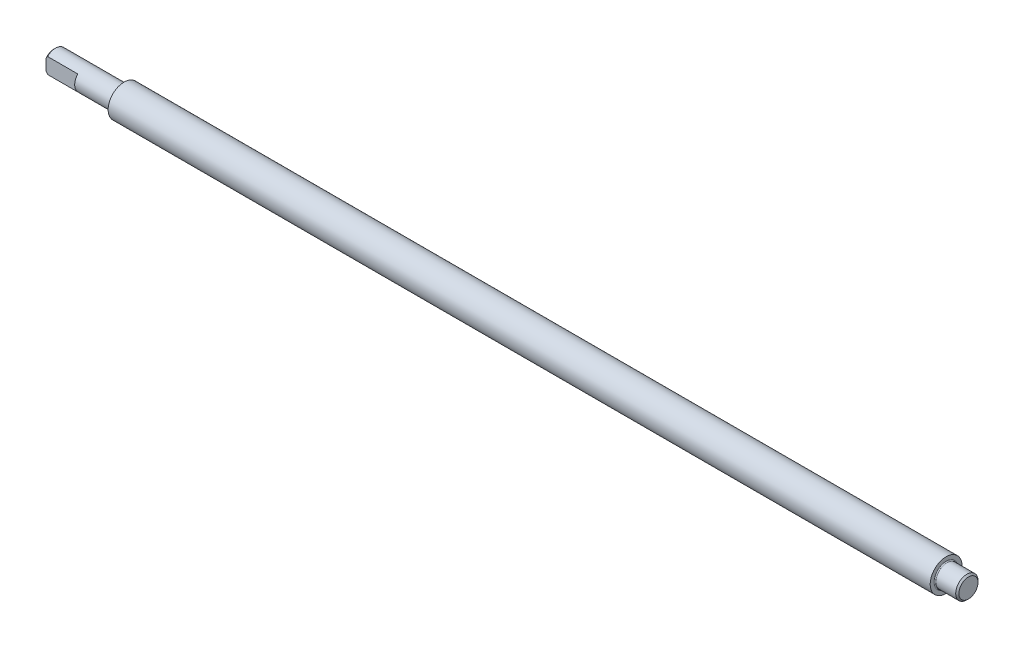
ISO-10303-21;
HEADER;
FILE_DESCRIPTION(('STEP AP214'),'2;1');
FILE_NAME('part.step','',(''),(''),'','','');
FILE_SCHEMA(('AUTOMOTIVE_DESIGN { 1 0 10303 214 1 1 1 1 }'));
ENDSEC;
DATA;
#1=APPLICATION_CONTEXT('core data for automotive mechanical design processes');
#2=APPLICATION_PROTOCOL_DEFINITION('international standard','automotive_design',2000,#1);
#3=PRODUCT_CONTEXT('',#1,'mechanical');
#4=PRODUCT('Part','Part','',(#3));
#5=PRODUCT_RELATED_PRODUCT_CATEGORY('part','',(#4));
#6=PRODUCT_DEFINITION_FORMATION('','',#4);
#7=PRODUCT_DEFINITION_CONTEXT('part definition',#1,'design');
#8=PRODUCT_DEFINITION('design','',#6,#7);
#9=PRODUCT_DEFINITION_SHAPE('','',#8);
#10=(LENGTH_UNIT() NAMED_UNIT(*) SI_UNIT(.MILLI.,.METRE.));
#11=(NAMED_UNIT(*) PLANE_ANGLE_UNIT() SI_UNIT($,.RADIAN.));
#12=(NAMED_UNIT(*) SI_UNIT($,.STERADIAN.) SOLID_ANGLE_UNIT());
#13=UNCERTAINTY_MEASURE_WITH_UNIT(LENGTH_MEASURE(1.E-05),#10,'distance_accuracy_value','');
#14=(GEOMETRIC_REPRESENTATION_CONTEXT(3) GLOBAL_UNCERTAINTY_ASSIGNED_CONTEXT((#13)) GLOBAL_UNIT_ASSIGNED_CONTEXT((#10,
#11,#12)) REPRESENTATION_CONTEXT('',''));
#15=CARTESIAN_POINT('',(0.,0.,0.));
#16=DIRECTION('',(0.,0.,1.));
#17=DIRECTION('',(1.,0.,0.));
#18=AXIS2_PLACEMENT_3D('',#15,#16,#17);
#19=CARTESIAN_POINT('',(280.,0.,0.));
#20=DIRECTION('',(1.,0.,0.));
#21=DIRECTION('',(0.,0.,-1.));
#22=AXIS2_PLACEMENT_3D('',#19,#20,#21);
#23=PLANE('',#22);
#24=CARTESIAN_POINT('',(280.,0.,0.));
#25=DIRECTION('',(1.,0.,0.));
#26=DIRECTION('',(0.,0.,-1.));
#27=AXIS2_PLACEMENT_3D('',#24,#25,#26);
#28=CIRCLE('',#27,3.79999999999988);
#29=CARTESIAN_POINT('',(280.,0.,-3.79999999999988));
#30=VERTEX_POINT('',#29);
#31=EDGE_CURVE('E11',#30,#30,#28,.F.);
#32=ORIENTED_EDGE('',*,*,#31,.T.);
#33=EDGE_LOOP('',(#32));
#34=FACE_BOUND('',#33,.T.);
#35=CARTESIAN_POINT('',(280.,0.,0.));
#36=DIRECTION('',(1.,0.,0.));
#37=DIRECTION('',(0.,0.,-1.));
#38=AXIS2_PLACEMENT_3D('',#35,#36,#37);
#39=CIRCLE('',#38,5.);
#40=CARTESIAN_POINT('',(280.,0.,-5.));
#41=VERTEX_POINT('',#40);
#42=EDGE_CURVE('E82',#41,#41,#39,.T.);
#43=ORIENTED_EDGE('',*,*,#42,.T.);
#44=EDGE_LOOP('',(#43));
#45=FACE_BOUND('',#44,.T.);
#46=ADVANCED_FACE('F33',(#34,#45),#23,.T.);
#47=CARTESIAN_POINT('',(22.,5.,0.));
#48=DIRECTION('',(-1.,0.,0.));
#49=DIRECTION('',(0.,0.,1.));
#50=AXIS2_PLACEMENT_3D('',#47,#48,#49);
#51=PLANE('',#50);
#52=CARTESIAN_POINT('',(22.,0.,0.));
#53=DIRECTION('',(-1.,0.,0.));
#54=DIRECTION('',(0.,0.,1.));
#55=AXIS2_PLACEMENT_3D('',#52,#53,#54);
#56=CIRCLE('',#55,3.79999999999989);
#57=CARTESIAN_POINT('',(22.,0.,3.79999999999989));
#58=VERTEX_POINT('',#57);
#59=EDGE_CURVE('E162',#58,#58,#56,.F.);
#60=ORIENTED_EDGE('',*,*,#59,.T.);
#61=EDGE_LOOP('',(#60));
#62=FACE_BOUND('',#61,.T.);
#63=CARTESIAN_POINT('',(22.,0.,0.));
#64=DIRECTION('',(1.,0.,0.));
#65=DIRECTION('',(0.,0.,-1.));
#66=AXIS2_PLACEMENT_3D('',#63,#64,#65);
#67=CIRCLE('',#66,5.);
#68=CARTESIAN_POINT('',(22.,0.,-5.));
#69=VERTEX_POINT('',#68);
#70=EDGE_CURVE('E88',#69,#69,#67,.T.);
#71=ORIENTED_EDGE('',*,*,#70,.F.);
#72=EDGE_LOOP('',(#71));
#73=FACE_BOUND('',#72,.T.);
#74=ADVANCED_FACE('F130',(#62,#73),#51,.T.);
#75=CARTESIAN_POINT('',(22.,0.,0.));
#76=DIRECTION('',(1.,0.,0.));
#77=DIRECTION('',(0.,0.,-1.));
#78=AXIS2_PLACEMENT_3D('',#75,#76,#77);
#79=CYLINDRICAL_SURFACE('',#78,5.);
#80=ORIENTED_EDGE('',*,*,#70,.T.);
#81=EDGE_LOOP('',(#80));
#82=FACE_BOUND('',#81,.T.);
#83=ORIENTED_EDGE('',*,*,#42,.F.);
#84=EDGE_LOOP('',(#83));
#85=FACE_BOUND('',#84,.T.);
#86=ADVANCED_FACE('F126',(#82,#85),#79,.T.);
#87=CARTESIAN_POINT('',(0.,0.,0.));
#88=DIRECTION('',(1.,0.,0.));
#89=DIRECTION('',(0.,0.,-1.));
#90=AXIS2_PLACEMENT_3D('',#87,#88,#89);
#91=CYLINDRICAL_SURFACE('',#90,3.5);
#92=CARTESIAN_POINT('',(21.7000000000001,0.,0.));
#93=DIRECTION('',(-1.,0.,0.));
#94=DIRECTION('',(0.,0.,1.));
#95=AXIS2_PLACEMENT_3D('',#92,#93,#94);
#96=CIRCLE('',#95,3.5);
#97=CARTESIAN_POINT('',(21.7000000000001,0.,3.5));
#98=VERTEX_POINT('',#97);
#99=EDGE_CURVE('E164',#98,#98,#96,.T.);
#100=ORIENTED_EDGE('',*,*,#99,.T.);
#101=EDGE_LOOP('',(#100));
#102=FACE_BOUND('',#101,.T.);
#103=DIRECTION('',(-1.,0.,0.));
#104=VECTOR('',#103,1.);
#105=CARTESIAN_POINT('',(10.,-2.44948974278318,2.5));
#106=LINE('',#105,#104);
#107=CARTESIAN_POINT('',(10.,-2.44948974278318,2.5));
#108=VERTEX_POINT('',#107);
#109=CARTESIAN_POINT('',(0.500000000007009,-2.44948974278318,2.5));
#110=VERTEX_POINT('',#109);
#111=EDGE_CURVE('E78',#108,#110,#106,.T.);
#112=ORIENTED_EDGE('',*,*,#111,.T.);
#113=CARTESIAN_POINT('',(0.500000000007009,0.,0.));
#114=DIRECTION('',(-1.,0.,0.));
#115=DIRECTION('',(0.,0.,1.));
#116=AXIS2_PLACEMENT_3D('',#113,#114,#115);
#117=CIRCLE('',#116,3.5);
#118=CARTESIAN_POINT('',(0.500000000007009,2.44948974278318,2.5));
#119=VERTEX_POINT('',#118);
#120=EDGE_CURVE('E48',#110,#119,#117,.F.);
#121=ORIENTED_EDGE('',*,*,#120,.T.);
#122=DIRECTION('',(-1.,0.,0.));
#123=VECTOR('',#122,1.);
#124=CARTESIAN_POINT('',(10.,2.44948974278318,2.5));
#125=LINE('',#124,#123);
#126=CARTESIAN_POINT('',(10.,2.44948974278318,2.5));
#127=VERTEX_POINT('',#126);
#128=EDGE_CURVE('E76',#127,#119,#125,.T.);
#129=ORIENTED_EDGE('',*,*,#128,.F.);
#130=CARTESIAN_POINT('',(10.,0.,0.));
#131=DIRECTION('',(-1.,0.,0.));
#132=DIRECTION('',(0.,0.,1.));
#133=AXIS2_PLACEMENT_3D('',#130,#131,#132);
#134=CIRCLE('',#133,3.5);
#135=EDGE_CURVE('E69',#108,#127,#134,.T.);
#136=ORIENTED_EDGE('',*,*,#135,.F.);
#137=EDGE_LOOP('',(#112,#121,#129,#136));
#138=FACE_BOUND('',#137,.T.);
#139=ADVANCED_FACE('F80',(#102,#138),#91,.T.);
#140=CARTESIAN_POINT('',(0.,0.,0.));
#141=DIRECTION('',(-1.,0.,0.));
#142=DIRECTION('',(0.,0.,1.));
#143=AXIS2_PLACEMENT_3D('',#140,#141,#142);
#144=PLANE('',#143);
#145=DIRECTION('',(0.,-1.,0.));
#146=VECTOR('',#145,1.);
#147=CARTESIAN_POINT('',(0.,2.44948974278318,2.5));
#148=LINE('',#147,#146);
#149=CARTESIAN_POINT('',(0.,1.65831239516506,2.5));
#150=VERTEX_POINT('',#149);
#151=CARTESIAN_POINT('',(0.,-1.65831239516506,2.5));
#152=VERTEX_POINT('',#151);
#153=EDGE_CURVE('E73',#150,#152,#148,.T.);
#154=ORIENTED_EDGE('',*,*,#153,.F.);
#155=CARTESIAN_POINT('',(0.,0.,0.));
#156=DIRECTION('',(-1.,0.,0.));
#157=DIRECTION('',(0.,0.,1.));
#158=AXIS2_PLACEMENT_3D('',#155,#156,#157);
#159=CIRCLE('',#158,2.99999999999301);
#160=EDGE_CURVE('E97',#150,#152,#159,.T.);
#161=ORIENTED_EDGE('',*,*,#160,.T.);
#162=EDGE_LOOP('',(#154,#161));
#163=FACE_BOUND('',#162,.T.);
#164=ADVANCED_FACE('F118',(#163),#144,.T.);
#165=CARTESIAN_POINT('',(10.,2.44948974278318,2.5));
#166=DIRECTION('',(0.,0.,-1.));
#167=DIRECTION('',(-1.,0.,0.));
#168=AXIS2_PLACEMENT_3D('',#165,#166,#167);
#169=PLANE('',#168);
#170=ORIENTED_EDGE('',*,*,#153,.T.);
#171=CARTESIAN_POINT('',(0.,-1.65831239516505,2.5));
#172=CARTESIAN_POINT('',(0.0377809523451697,-1.7266330545231,2.5));
#173=CARTESIAN_POINT('',(0.0767732564831151,-1.79426868491071,2.5));
#174=CARTESIAN_POINT('',(0.156787445383791,-1.92826794918863,2.5));
#175=CARTESIAN_POINT('',(0.19780791905321,-1.99463242409499,2.5));
#176=CARTESIAN_POINT('',(0.281531404899727,-2.12627015613553,2.5));
#177=CARTESIAN_POINT('',(0.324234143713186,-2.19154358812609,2.5));
#178=CARTESIAN_POINT('',(0.41109621527181,-2.3211800929932,2.5));
#179=CARTESIAN_POINT('',(0.45525652627714,-2.38554251126645,2.5));
#180=CARTESIAN_POINT('',(0.500000000007009,-2.44948974278318,2.5));
#181=B_SPLINE_CURVE_WITH_KNOTS('',3,(#171,#172,#173,#174,#175,#176,#177,#178,#179,#180),
.UNSPECIFIED.,.F.,.F.,(4,2,2,2,4),(0.,0.234182191469756,0.468203683211642,0.702187302682748,
0.936331289720606),.UNSPECIFIED.);
#182=EDGE_CURVE('E56',#152,#110,#181,.T.);
#183=ORIENTED_EDGE('',*,*,#182,.T.);
#184=ORIENTED_EDGE('',*,*,#111,.F.);
#185=DIRECTION('',(0.,-1.,0.));
#186=VECTOR('',#185,1.);
#187=CARTESIAN_POINT('',(10.,2.44948974278318,2.5));
#188=LINE('',#187,#186);
#189=EDGE_CURVE('E72',#127,#108,#188,.T.);
#190=ORIENTED_EDGE('',*,*,#189,.F.);
#191=ORIENTED_EDGE('',*,*,#128,.T.);
#192=CARTESIAN_POINT('',(0.500000000007009,2.44948974278318,2.5));
#193=CARTESIAN_POINT('',(0.45525652627714,2.38554251126645,2.5));
#194=CARTESIAN_POINT('',(0.41109621527181,2.3211800929932,2.5));
#195=CARTESIAN_POINT('',(0.324234143713186,2.19154358812609,2.5));
#196=CARTESIAN_POINT('',(0.281531404899727,2.12627015613553,2.5));
#197=CARTESIAN_POINT('',(0.197807919053209,1.99463242409499,2.5));
#198=CARTESIAN_POINT('',(0.15678744538379,1.92826794918863,2.5));
#199=CARTESIAN_POINT('',(0.0767732564831149,1.79426868491071,2.5));
#200=CARTESIAN_POINT('',(0.0377809523451696,1.7266330545231,2.5));
#201=CARTESIAN_POINT('',(0.,1.65831239516505,2.5));
#202=B_SPLINE_CURVE_WITH_KNOTS('',3,(#192,#193,#194,#195,#196,#197,#198,#199,#200,#201),
.UNSPECIFIED.,.F.,.F.,(4,2,2,2,4),(0.,0.234143987037858,0.468127606508965,0.702149098250851,
0.936331289720607),.UNSPECIFIED.);
#203=EDGE_CURVE('E100',#119,#150,#202,.T.);
#204=ORIENTED_EDGE('',*,*,#203,.T.);
#205=EDGE_LOOP('',(#170,#183,#184,#190,#191,#204));
#206=FACE_BOUND('',#205,.T.);
#207=ADVANCED_FACE('F75',(#206),#169,.F.);
#208=CARTESIAN_POINT('',(10.,0.,0.));
#209=DIRECTION('',(-1.,0.,0.));
#210=DIRECTION('',(0.,0.,1.));
#211=AXIS2_PLACEMENT_3D('',#208,#209,#210);
#212=PLANE('',#211);
#213=ORIENTED_EDGE('',*,*,#135,.T.);
#214=ORIENTED_EDGE('',*,*,#189,.T.);
#215=EDGE_LOOP('',(#213,#214));
#216=FACE_BOUND('',#215,.T.);
#217=ADVANCED_FACE('F71',(#216),#212,.T.);
#218=CARTESIAN_POINT('',(287.,0.,0.));
#219=DIRECTION('',(-1.,0.,0.));
#220=DIRECTION('',(0.,0.,1.));
#221=AXIS2_PLACEMENT_3D('',#218,#219,#220);
#222=CYLINDRICAL_SURFACE('',#221,3.49999999999999);
#223=CARTESIAN_POINT('',(280.3,0.,0.));
#224=DIRECTION('',(1.,0.,0.));
#225=DIRECTION('',(0.,0.,-1.));
#226=AXIS2_PLACEMENT_3D('',#223,#224,#225);
#227=CIRCLE('',#226,3.49999999999999);
#228=CARTESIAN_POINT('',(280.3,0.,3.49999999999999));
#229=VERTEX_POINT('',#228);
#230=EDGE_CURVE('E41',#229,#229,#227,.T.);
#231=CARTESIAN_POINT('',(286.499999999993,0.,0.));
#232=DIRECTION('',(1.,0.,0.));
#233=DIRECTION('',(0.,0.,-1.));
#234=AXIS2_PLACEMENT_3D('',#231,#232,#233);
#235=CIRCLE('',#234,3.49999999999999);
#236=CARTESIAN_POINT('',(286.499999999993,0.,3.49999999999999));
#237=VERTEX_POINT('',#236);
#238=EDGE_CURVE('E94',#237,#237,#235,.F.);
#239=CARTESIAN_POINT('',(280.3,0.,3.49999999999999));
#240=CARTESIAN_POINT('',(280.364583333333,0.,3.49999999999999));
#241=CARTESIAN_POINT('',(280.429166666666,0.,3.49999999999999));
#242=CARTESIAN_POINT('',(280.558333333333,0.,3.49999999999999));
#243=CARTESIAN_POINT('',(280.622916666666,0.,3.49999999999999));
#244=CARTESIAN_POINT('',(280.752083333333,0.,3.49999999999999));
#245=CARTESIAN_POINT('',(280.816666666666,0.,3.49999999999999));
#246=CARTESIAN_POINT('',(280.945833333333,0.,3.49999999999999));
#247=CARTESIAN_POINT('',(281.010416666666,0.,3.49999999999999));
#248=CARTESIAN_POINT('',(281.139583333332,0.,3.49999999999999));
#249=CARTESIAN_POINT('',(281.204166666666,0.,3.49999999999999));
#250=CARTESIAN_POINT('',(281.333333333332,0.,3.49999999999999));
#251=CARTESIAN_POINT('',(281.397916666665,0.,3.49999999999999));
#252=CARTESIAN_POINT('',(281.527083333332,0.,3.49999999999999));
#253=CARTESIAN_POINT('',(281.591666666665,0.,3.49999999999999));
#254=CARTESIAN_POINT('',(281.720833333332,0.,3.49999999999999));
#255=CARTESIAN_POINT('',(281.785416666665,0.,3.49999999999999));
#256=CARTESIAN_POINT('',(281.914583333331,0.,3.49999999999999));
#257=CARTESIAN_POINT('',(281.979166666665,0.,3.49999999999999));
#258=CARTESIAN_POINT('',(282.108333333331,0.,3.49999999999999));
#259=CARTESIAN_POINT('',(282.172916666665,0.,3.49999999999999));
#260=CARTESIAN_POINT('',(282.302083333331,0.,3.49999999999999));
#261=CARTESIAN_POINT('',(282.366666666664,0.,3.49999999999999));
#262=CARTESIAN_POINT('',(282.495833333331,0.,3.49999999999999));
#263=CARTESIAN_POINT('',(282.560416666664,0.,3.49999999999999));
#264=CARTESIAN_POINT('',(282.689583333331,0.,3.49999999999999));
#265=CARTESIAN_POINT('',(282.754166666664,0.,3.49999999999999));
#266=CARTESIAN_POINT('',(282.88333333333,0.,3.49999999999999));
#267=CARTESIAN_POINT('',(282.947916666664,0.,3.49999999999999));
#268=CARTESIAN_POINT('',(283.07708333333,0.,3.49999999999999));
#269=CARTESIAN_POINT('',(283.141666666663,0.,3.49999999999999));
#270=CARTESIAN_POINT('',(283.27083333333,0.,3.49999999999999));
#271=CARTESIAN_POINT('',(283.335416666663,0.,3.49999999999999));
#272=CARTESIAN_POINT('',(283.46458333333,0.,3.49999999999999));
#273=CARTESIAN_POINT('',(283.529166666663,0.,3.49999999999999));
#274=CARTESIAN_POINT('',(283.65833333333,0.,3.49999999999999));
#275=CARTESIAN_POINT('',(283.722916666663,0.,3.49999999999999));
#276=CARTESIAN_POINT('',(283.852083333329,0.,3.49999999999999));
#277=CARTESIAN_POINT('',(283.916666666663,0.,3.49999999999999));
#278=CARTESIAN_POINT('',(284.045833333329,0.,3.49999999999999));
#279=CARTESIAN_POINT('',(284.110416666662,0.,3.49999999999999));
#280=CARTESIAN_POINT('',(284.239583333329,0.,3.49999999999999));
#281=CARTESIAN_POINT('',(284.304166666662,0.,3.49999999999999));
#282=CARTESIAN_POINT('',(284.433333333329,0.,3.49999999999999));
#283=CARTESIAN_POINT('',(284.497916666662,0.,3.49999999999999));
#284=CARTESIAN_POINT('',(284.627083333328,0.,3.49999999999999));
#285=CARTESIAN_POINT('',(284.691666666662,0.,3.49999999999999));
#286=CARTESIAN_POINT('',(284.820833333328,0.,3.49999999999999));
#287=CARTESIAN_POINT('',(284.885416666662,0.,3.49999999999999));
#288=CARTESIAN_POINT('',(285.014583333328,0.,3.49999999999999));
#289=CARTESIAN_POINT('',(285.079166666661,0.,3.49999999999999));
#290=CARTESIAN_POINT('',(285.208333333328,0.,3.49999999999999));
#291=CARTESIAN_POINT('',(285.272916666661,0.,3.49999999999999));
#292=CARTESIAN_POINT('',(285.402083333328,0.,3.49999999999999));
#293=CARTESIAN_POINT('',(285.466666666661,0.,3.49999999999999));
#294=CARTESIAN_POINT('',(285.595833333327,0.,3.49999999999999));
#295=CARTESIAN_POINT('',(285.660416666661,0.,3.49999999999999));
#296=CARTESIAN_POINT('',(285.789583333327,0.,3.49999999999999));
#297=CARTESIAN_POINT('',(285.854166666661,0.,3.49999999999999));
#298=CARTESIAN_POINT('',(285.983333333327,0.,3.49999999999999));
#299=CARTESIAN_POINT('',(286.04791666666,0.,3.49999999999999));
#300=CARTESIAN_POINT('',(286.177083333327,0.,3.49999999999999));
#301=CARTESIAN_POINT('',(286.24166666666,0.,3.49999999999999));
#302=CARTESIAN_POINT('',(286.370833333327,0.,3.49999999999999));
#303=CARTESIAN_POINT('',(286.43541666666,0.,3.49999999999999));
#304=CARTESIAN_POINT('',(286.499999999993,0.,3.49999999999999));
#305=B_SPLINE_CURVE_WITH_KNOTS('',3,(#239,#240,#241,#242,#243,#244,#245,#246,#247,#248,#249,
#250,#251,#252,#253,#254,#255,#256,#257,#258,#259,#260,#261,#262,#263,#264,#265,#266,#267,#268,
#269,#270,#271,#272,#273,#274,#275,#276,#277,#278,#279,#280,#281,#282,#283,#284,#285,#286,#287,
#288,#289,#290,#291,#292,#293,#294,#295,#296,#297,#298,#299,#300,#301,#302,#303,#304),
.UNSPECIFIED.,.F.,.F.,(4,2,2,2,2,2,2,2,2,2,2,2,2,2,2,2,2,2,2,2,2,2,2,2,2,2,2,2,2,2,2,2,4),(0.,
0.19374999999977,0.387499999999541,0.581249999999311,0.774999999999137,0.968749999998908,
1.16249999999868,1.3562499999985,1.54999999999827,1.74374999999805,1.93749999999787,
2.13124999999764,2.32499999999741,2.51874999999724,2.71249999999701,2.90624999999678,
3.09999999999661,3.29374999999638,3.48749999999615,3.68124999999592,3.87499999999574,
4.06874999999551,4.26249999999528,4.45624999999511,4.64999999999488,4.84374999999465,
5.03749999999448,5.23124999999425,5.42499999999402,5.61874999999384,5.81249999999361,
6.00624999999338,6.19999999999321),.UNSPECIFIED.);
#306=EDGE_CURVE('BSEAM147',#229,#237,#305,.T.);
#307=ORIENTED_EDGE('',*,*,#230,.T.);
#308=ORIENTED_EDGE('',*,*,#238,.T.);
#309=ORIENTED_EDGE('',*,*,#306,.T.);
#310=ORIENTED_EDGE('',*,*,#306,.F.);
#311=EDGE_LOOP('',(#307,#309,#308,#310));
#312=FACE_BOUND('',#311,.T.);
#313=ADVANCED_FACE('F147',(#312),#222,.T.);
#314=CARTESIAN_POINT('',(287.,0.,0.));
#315=DIRECTION('',(1.,0.,0.));
#316=DIRECTION('',(0.,0.,-1.));
#317=AXIS2_PLACEMENT_3D('',#314,#315,#316);
#318=PLANE('',#317);
#319=CARTESIAN_POINT('',(287.,0.,0.));
#320=DIRECTION('',(1.,0.,0.));
#321=DIRECTION('',(0.,0.,-1.));
#322=AXIS2_PLACEMENT_3D('',#319,#320,#321);
#323=CIRCLE('',#322,2.99999999999312);
#324=CARTESIAN_POINT('',(287.,0.,-2.99999999999312));
#325=VERTEX_POINT('',#324);
#326=EDGE_CURVE('E91',#325,#325,#323,.T.);
#327=ORIENTED_EDGE('',*,*,#326,.T.);
#328=EDGE_LOOP('',(#327));
#329=FACE_BOUND('',#328,.T.);
#330=ADVANCED_FACE('F139',(#329),#318,.T.);
#331=CARTESIAN_POINT('',(287.,0.,0.));
#332=DIRECTION('',(-1.,0.,0.));
#333=DIRECTION('',(0.,0.,1.));
#334=AXIS2_PLACEMENT_3D('',#331,#332,#333);
#335=CONICAL_SURFACE('',#334,2.99999999999312,0.785398163397436);
#336=ORIENTED_EDGE('',*,*,#238,.F.);
#337=EDGE_LOOP('',(#336));
#338=FACE_BOUND('',#337,.T.);
#339=ORIENTED_EDGE('',*,*,#326,.F.);
#340=EDGE_LOOP('',(#339));
#341=FACE_BOUND('',#340,.T.);
#342=ADVANCED_FACE('F137',(#338,#341),#335,.T.);
#343=CARTESIAN_POINT('',(0.,0.,0.));
#344=DIRECTION('',(1.,0.,0.));
#345=DIRECTION('',(0.,0.,-1.));
#346=AXIS2_PLACEMENT_3D('',#343,#344,#345);
#347=CONICAL_SURFACE('',#346,2.99999999999301,0.785398163397424);
#348=ORIENTED_EDGE('',*,*,#203,.F.);
#349=ORIENTED_EDGE('',*,*,#120,.F.);
#350=ORIENTED_EDGE('',*,*,#182,.F.);
#351=ORIENTED_EDGE('',*,*,#160,.F.);
#352=EDGE_LOOP('',(#348,#349,#350,#351));
#353=FACE_BOUND('',#352,.T.);
#354=ADVANCED_FACE('F111',(#353),#347,.T.);
#355=CARTESIAN_POINT('',(21.7000000000001,0.,0.));
#356=DIRECTION('',(-1.,0.,0.));
#357=DIRECTION('',(0.,0.,1.));
#358=AXIS2_PLACEMENT_3D('',#355,#356,#357);
#359=TOROIDAL_SURFACE('',#358,3.79999999999989,0.299999999999888);
#360=ORIENTED_EDGE('',*,*,#59,.F.);
#361=EDGE_LOOP('',(#360));
#362=FACE_BOUND('',#361,.T.);
#363=ORIENTED_EDGE('',*,*,#99,.F.);
#364=EDGE_LOOP('',(#363));
#365=FACE_BOUND('',#364,.T.);
#366=ADVANCED_FACE('F145',(#362,#365),#359,.F.);
#367=CARTESIAN_POINT('',(280.3,0.,0.));
#368=DIRECTION('',(1.,0.,0.));
#369=DIRECTION('',(0.,0.,-1.));
#370=AXIS2_PLACEMENT_3D('',#367,#368,#369);
#371=TOROIDAL_SURFACE('',#370,3.79999999999988,0.299999999999888);
#372=ORIENTED_EDGE('',*,*,#31,.F.);
#373=EDGE_LOOP('',(#372));
#374=FACE_BOUND('',#373,.T.);
#375=ORIENTED_EDGE('',*,*,#230,.F.);
#376=EDGE_LOOP('',(#375));
#377=FACE_BOUND('',#376,.T.);
#378=ADVANCED_FACE('F35',(#374,#377),#371,.F.);
#379=CLOSED_SHELL('',(#46,#74,#86,#139,#164,#207,#217,#313,#330,#342,#354,#366,#378));
#380=MANIFOLD_SOLID_BREP('B2',#379);
#381=ADVANCED_BREP_SHAPE_REPRESENTATION('',(#18,#380),#14);
#382=SHAPE_DEFINITION_REPRESENTATION(#9,#381);
ENDSEC;
END-ISO-10303-21;
